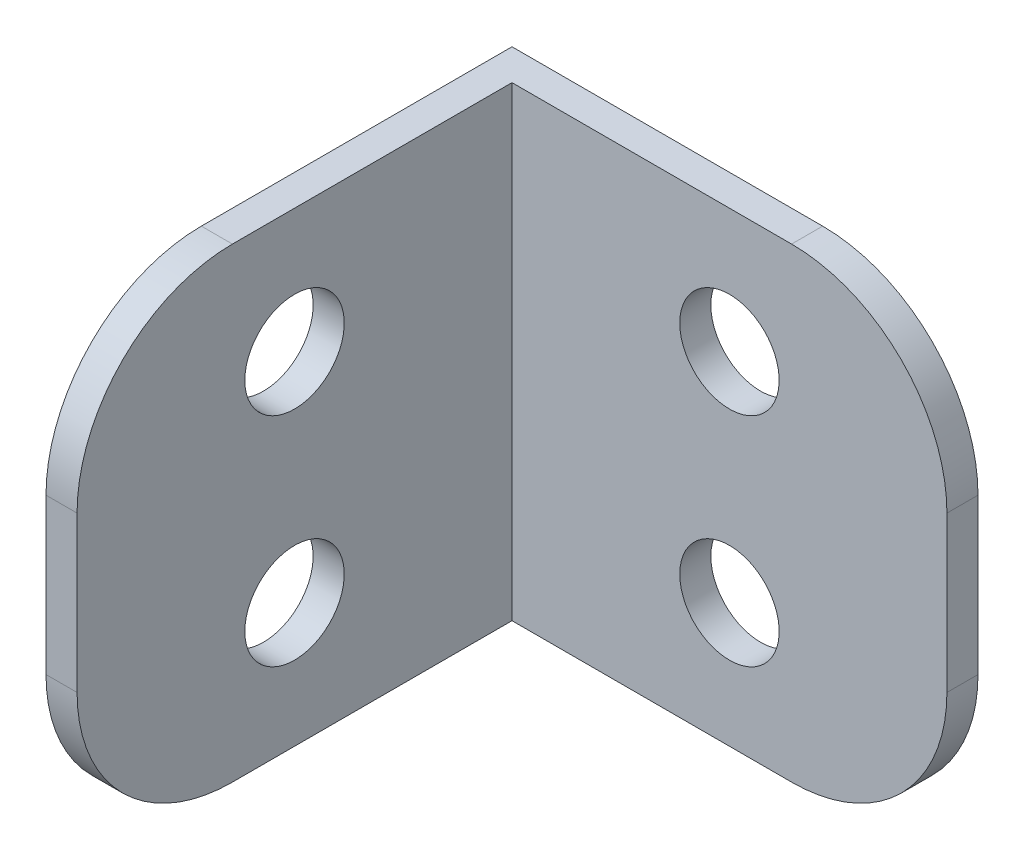
ISO-10303-21;
HEADER;
FILE_DESCRIPTION(('STEP AP214'),'2;1');
FILE_NAME('part.step','',(''),(''),'','','');
FILE_SCHEMA(('AUTOMOTIVE_DESIGN { 1 0 10303 214 1 1 1 1 }'));
ENDSEC;
DATA;
#1=APPLICATION_CONTEXT('core data for automotive mechanical design processes');
#2=APPLICATION_PROTOCOL_DEFINITION('international standard','automotive_design',2000,#1);
#3=PRODUCT_CONTEXT('',#1,'mechanical');
#4=PRODUCT('Part','Part','',(#3));
#5=PRODUCT_RELATED_PRODUCT_CATEGORY('part','',(#4));
#6=PRODUCT_DEFINITION_FORMATION('','',#4);
#7=PRODUCT_DEFINITION_CONTEXT('part definition',#1,'design');
#8=PRODUCT_DEFINITION('design','',#6,#7);
#9=PRODUCT_DEFINITION_SHAPE('','',#8);
#10=(LENGTH_UNIT() NAMED_UNIT(*) SI_UNIT(.MILLI.,.METRE.));
#11=(NAMED_UNIT(*) PLANE_ANGLE_UNIT() SI_UNIT($,.RADIAN.));
#12=(NAMED_UNIT(*) SI_UNIT($,.STERADIAN.) SOLID_ANGLE_UNIT());
#13=UNCERTAINTY_MEASURE_WITH_UNIT(LENGTH_MEASURE(1.E-05),#10,'distance_accuracy_value','');
#14=(GEOMETRIC_REPRESENTATION_CONTEXT(3) GLOBAL_UNCERTAINTY_ASSIGNED_CONTEXT((#13)) GLOBAL_UNIT_ASSIGNED_CONTEXT((#10,
#11,#12)) REPRESENTATION_CONTEXT('',''));
#15=CARTESIAN_POINT('',(0.,0.,0.));
#16=DIRECTION('',(0.,0.,1.));
#17=DIRECTION('',(1.,0.,0.));
#18=AXIS2_PLACEMENT_3D('',#15,#16,#17);
#19=CARTESIAN_POINT('',(0.,15.,1.));
#20=DIRECTION('',(-1.,0.,0.));
#21=DIRECTION('',(0.,0.,1.));
#22=AXIS2_PLACEMENT_3D('',#19,#20,#21);
#23=PLANE('',#22);
#24=DIRECTION('',(0.,-1.,0.));
#25=VECTOR('',#24,1.);
#26=CARTESIAN_POINT('',(0.,15.,1.));
#27=LINE('',#26,#25);
#28=CARTESIAN_POINT('',(0.,10.,1.));
#29=VERTEX_POINT('',#28);
#30=CARTESIAN_POINT('',(0.,5.,1.));
#31=VERTEX_POINT('',#30);
#32=EDGE_CURVE('E165',#29,#31,#27,.T.);
#33=ORIENTED_EDGE('',*,*,#32,.T.);
#34=DIRECTION('',(0.,0.,-1.));
#35=VECTOR('',#34,1.);
#36=CARTESIAN_POINT('',(0.,5.,1.));
#37=LINE('',#36,#35);
#38=CARTESIAN_POINT('',(0.,5.,0.));
#39=VERTEX_POINT('',#38);
#40=EDGE_CURVE('E223',#31,#39,#37,.T.);
#41=ORIENTED_EDGE('',*,*,#40,.T.);
#42=DIRECTION('',(0.,-1.,0.));
#43=VECTOR('',#42,1.);
#44=CARTESIAN_POINT('',(0.,15.,0.));
#45=LINE('',#44,#43);
#46=CARTESIAN_POINT('',(0.,10.,0.));
#47=VERTEX_POINT('',#46);
#48=EDGE_CURVE('E148',#47,#39,#45,.T.);
#49=ORIENTED_EDGE('',*,*,#48,.F.);
#50=DIRECTION('',(0.,0.,-1.));
#51=VECTOR('',#50,1.);
#52=CARTESIAN_POINT('',(0.,10.,1.));
#53=LINE('',#52,#51);
#54=EDGE_CURVE('E66',#47,#29,#53,.F.);
#55=ORIENTED_EDGE('',*,*,#54,.T.);
#56=EDGE_LOOP('',(#33,#41,#49,#55));
#57=FACE_BOUND('',#56,.T.);
#58=ADVANCED_FACE('F43',(#57),#23,.F.);
#59=CARTESIAN_POINT('',(0.,15.,0.));
#60=DIRECTION('',(0.,0.,1.));
#61=DIRECTION('',(1.,0.,0.));
#62=AXIS2_PLACEMENT_3D('',#59,#60,#61);
#63=PLANE('',#62);
#64=CARTESIAN_POINT('',(-7.,11.,0.));
#65=DIRECTION('',(0.,0.,-1.));
#66=DIRECTION('',(-1.,0.,0.));
#67=AXIS2_PLACEMENT_3D('',#64,#65,#66);
#68=CIRCLE('',#67,1.6);
#69=CARTESIAN_POINT('',(-8.6,11.,0.));
#70=VERTEX_POINT('',#69);
#71=EDGE_CURVE('E239',#70,#70,#68,.T.);
#72=ORIENTED_EDGE('',*,*,#71,.F.);
#73=EDGE_LOOP('',(#72));
#74=FACE_BOUND('',#73,.T.);
#75=CARTESIAN_POINT('',(-7.,4.,0.));
#76=DIRECTION('',(0.,0.,-1.));
#77=DIRECTION('',(-1.,0.,0.));
#78=AXIS2_PLACEMENT_3D('',#75,#76,#77);
#79=CIRCLE('',#78,1.6);
#80=CARTESIAN_POINT('',(-8.6,4.,0.));
#81=VERTEX_POINT('',#80);
#82=EDGE_CURVE('E251',#81,#81,#79,.T.);
#83=ORIENTED_EDGE('',*,*,#82,.F.);
#84=EDGE_LOOP('',(#83));
#85=FACE_BOUND('',#84,.T.);
#86=ORIENTED_EDGE('',*,*,#48,.T.);
#87=CARTESIAN_POINT('',(-5.,5.,0.));
#88=DIRECTION('',(0.,0.,1.));
#89=DIRECTION('',(1.,0.,0.));
#90=AXIS2_PLACEMENT_3D('',#87,#88,#89);
#91=CIRCLE('',#90,5.);
#92=CARTESIAN_POINT('',(-5.,0.,0.));
#93=VERTEX_POINT('',#92);
#94=EDGE_CURVE('E230',#39,#93,#91,.F.);
#95=ORIENTED_EDGE('',*,*,#94,.T.);
#96=DIRECTION('',(-1.,0.,0.));
#97=VECTOR('',#96,1.);
#98=CARTESIAN_POINT('',(0.,0.,0.));
#99=LINE('',#98,#97);
#100=CARTESIAN_POINT('',(-15.,0.,0.));
#101=VERTEX_POINT('',#100);
#102=EDGE_CURVE('E143',#93,#101,#99,.T.);
#103=ORIENTED_EDGE('',*,*,#102,.T.);
#104=DIRECTION('',(0.,-1.,0.));
#105=VECTOR('',#104,1.);
#106=CARTESIAN_POINT('',(-15.,15.,0.));
#107=LINE('',#106,#105);
#108=CARTESIAN_POINT('',(-15.,15.,0.));
#109=VERTEX_POINT('',#108);
#110=EDGE_CURVE('E139',#109,#101,#107,.T.);
#111=ORIENTED_EDGE('',*,*,#110,.F.);
#112=DIRECTION('',(-1.,0.,0.));
#113=VECTOR('',#112,1.);
#114=CARTESIAN_POINT('',(0.,15.,0.));
#115=LINE('',#114,#113);
#116=CARTESIAN_POINT('',(-5.,15.,0.));
#117=VERTEX_POINT('',#116);
#118=EDGE_CURVE('E124',#117,#109,#115,.T.);
#119=ORIENTED_EDGE('',*,*,#118,.F.);
#120=CARTESIAN_POINT('',(-5.,10.,0.));
#121=DIRECTION('',(0.,0.,1.));
#122=DIRECTION('',(1.,0.,0.));
#123=AXIS2_PLACEMENT_3D('',#120,#121,#122);
#124=CIRCLE('',#123,5.);
#125=EDGE_CURVE('E227',#117,#47,#124,.F.);
#126=ORIENTED_EDGE('',*,*,#125,.T.);
#127=EDGE_LOOP('',(#86,#95,#103,#111,#119,#126));
#128=FACE_BOUND('',#127,.T.);
#129=ADVANCED_FACE('F141',(#74,#85,#128),#63,.F.);
#130=CARTESIAN_POINT('',(-15.,15.,0.));
#131=DIRECTION('',(1.,0.,0.));
#132=DIRECTION('',(0.,0.,-1.));
#133=AXIS2_PLACEMENT_3D('',#130,#131,#132);
#134=PLANE('',#133);
#135=CARTESIAN_POINT('',(-15.,11.,8.));
#136=DIRECTION('',(-1.,0.,0.));
#137=DIRECTION('',(0.,0.,1.));
#138=AXIS2_PLACEMENT_3D('',#135,#136,#137);
#139=CIRCLE('',#138,1.6);
#140=CARTESIAN_POINT('',(-15.,11.,9.6));
#141=VERTEX_POINT('',#140);
#142=EDGE_CURVE('E245',#141,#141,#139,.T.);
#143=ORIENTED_EDGE('',*,*,#142,.F.);
#144=EDGE_LOOP('',(#143));
#145=FACE_BOUND('',#144,.T.);
#146=CARTESIAN_POINT('',(-15.,4.,8.));
#147=DIRECTION('',(-1.,0.,0.));
#148=DIRECTION('',(0.,0.,1.));
#149=AXIS2_PLACEMENT_3D('',#146,#147,#148);
#150=CIRCLE('',#149,1.6);
#151=CARTESIAN_POINT('',(-15.,4.,9.6));
#152=VERTEX_POINT('',#151);
#153=EDGE_CURVE('E253',#152,#152,#150,.T.);
#154=ORIENTED_EDGE('',*,*,#153,.F.);
#155=EDGE_LOOP('',(#154));
#156=FACE_BOUND('',#155,.T.);
#157=DIRECTION('',(0.,-1.,0.));
#158=VECTOR('',#157,1.);
#159=CARTESIAN_POINT('',(-15.,15.,15.));
#160=LINE('',#159,#158);
#161=CARTESIAN_POINT('',(-15.,10.,15.));
#162=VERTEX_POINT('',#161);
#163=CARTESIAN_POINT('',(-15.,5.,15.));
#164=VERTEX_POINT('',#163);
#165=EDGE_CURVE('E149',#162,#164,#160,.T.);
#166=ORIENTED_EDGE('',*,*,#165,.F.);
#167=CARTESIAN_POINT('',(-15.,10.,10.));
#168=DIRECTION('',(1.,0.,0.));
#169=DIRECTION('',(0.,0.,-1.));
#170=AXIS2_PLACEMENT_3D('',#167,#168,#169);
#171=CIRCLE('',#170,5.);
#172=CARTESIAN_POINT('',(-15.,15.,10.));
#173=VERTEX_POINT('',#172);
#174=EDGE_CURVE('E154',#162,#173,#171,.F.);
#175=ORIENTED_EDGE('',*,*,#174,.T.);
#176=DIRECTION('',(0.,0.,1.));
#177=VECTOR('',#176,1.);
#178=CARTESIAN_POINT('',(-15.,15.,0.));
#179=LINE('',#178,#177);
#180=EDGE_CURVE('E129',#109,#173,#179,.T.);
#181=ORIENTED_EDGE('',*,*,#180,.F.);
#182=ORIENTED_EDGE('',*,*,#110,.T.);
#183=DIRECTION('',(0.,0.,1.));
#184=VECTOR('',#183,1.);
#185=CARTESIAN_POINT('',(-15.,0.,0.));
#186=LINE('',#185,#184);
#187=CARTESIAN_POINT('',(-15.,0.,10.));
#188=VERTEX_POINT('',#187);
#189=EDGE_CURVE('E168',#101,#188,#186,.T.);
#190=ORIENTED_EDGE('',*,*,#189,.T.);
#191=CARTESIAN_POINT('',(-15.,5.,10.));
#192=DIRECTION('',(1.,0.,0.));
#193=DIRECTION('',(0.,0.,-1.));
#194=AXIS2_PLACEMENT_3D('',#191,#192,#193);
#195=CIRCLE('',#194,5.);
#196=EDGE_CURVE('E210',#188,#164,#195,.F.);
#197=ORIENTED_EDGE('',*,*,#196,.T.);
#198=EDGE_LOOP('',(#166,#175,#181,#182,#190,#197));
#199=FACE_BOUND('',#198,.T.);
#200=ADVANCED_FACE('F152',(#145,#156,#199),#134,.F.);
#201=CARTESIAN_POINT('',(-15.,15.,15.));
#202=DIRECTION('',(0.,0.,-1.));
#203=DIRECTION('',(-1.,0.,0.));
#204=AXIS2_PLACEMENT_3D('',#201,#202,#203);
#205=PLANE('',#204);
#206=DIRECTION('',(0.,-1.,0.));
#207=VECTOR('',#206,1.);
#208=CARTESIAN_POINT('',(-14.,15.,15.));
#209=LINE('',#208,#207);
#210=CARTESIAN_POINT('',(-14.,10.,15.));
#211=VERTEX_POINT('',#210);
#212=CARTESIAN_POINT('',(-14.,5.,15.));
#213=VERTEX_POINT('',#212);
#214=EDGE_CURVE('E183',#211,#213,#209,.T.);
#215=ORIENTED_EDGE('',*,*,#214,.F.);
#216=DIRECTION('',(1.,0.,0.));
#217=VECTOR('',#216,1.);
#218=CARTESIAN_POINT('',(-15.,10.,15.));
#219=LINE('',#218,#217);
#220=EDGE_CURVE('E207',#211,#162,#219,.F.);
#221=ORIENTED_EDGE('',*,*,#220,.T.);
#222=ORIENTED_EDGE('',*,*,#165,.T.);
#223=DIRECTION('',(1.,0.,0.));
#224=VECTOR('',#223,1.);
#225=CARTESIAN_POINT('',(-15.,5.,15.));
#226=LINE('',#225,#224);
#227=EDGE_CURVE('E203',#164,#213,#226,.T.);
#228=ORIENTED_EDGE('',*,*,#227,.T.);
#229=EDGE_LOOP('',(#215,#221,#222,#228));
#230=FACE_BOUND('',#229,.T.);
#231=ADVANCED_FACE('F277',(#230),#205,.F.);
#232=CARTESIAN_POINT('',(-14.,15.,15.));
#233=DIRECTION('',(-1.,0.,0.));
#234=DIRECTION('',(0.,0.,1.));
#235=AXIS2_PLACEMENT_3D('',#232,#233,#234);
#236=PLANE('',#235);
#237=CARTESIAN_POINT('',(-14.,11.,8.));
#238=DIRECTION('',(-1.,0.,0.));
#239=DIRECTION('',(0.,0.,1.));
#240=AXIS2_PLACEMENT_3D('',#237,#238,#239);
#241=CIRCLE('',#240,1.6);
#242=CARTESIAN_POINT('',(-14.,11.,9.6));
#243=VERTEX_POINT('',#242);
#244=EDGE_CURVE('E47',#243,#243,#241,.T.);
#245=ORIENTED_EDGE('',*,*,#244,.T.);
#246=EDGE_LOOP('',(#245));
#247=FACE_BOUND('',#246,.T.);
#248=CARTESIAN_POINT('',(-14.,4.,8.));
#249=DIRECTION('',(-1.,0.,0.));
#250=DIRECTION('',(0.,0.,1.));
#251=AXIS2_PLACEMENT_3D('',#248,#249,#250);
#252=CIRCLE('',#251,1.6);
#253=CARTESIAN_POINT('',(-14.,4.,9.6));
#254=VERTEX_POINT('',#253);
#255=EDGE_CURVE('E242',#254,#254,#252,.T.);
#256=ORIENTED_EDGE('',*,*,#255,.T.);
#257=EDGE_LOOP('',(#256));
#258=FACE_BOUND('',#257,.T.);
#259=DIRECTION('',(0.,0.,-1.));
#260=VECTOR('',#259,1.);
#261=CARTESIAN_POINT('',(-14.,15.,15.));
#262=LINE('',#261,#260);
#263=CARTESIAN_POINT('',(-14.,15.,10.));
#264=VERTEX_POINT('',#263);
#265=CARTESIAN_POINT('',(-14.,15.,1.));
#266=VERTEX_POINT('',#265);
#267=EDGE_CURVE('E156',#264,#266,#262,.T.);
#268=ORIENTED_EDGE('',*,*,#267,.F.);
#269=CARTESIAN_POINT('',(-14.,10.,10.));
#270=DIRECTION('',(-1.,0.,0.));
#271=DIRECTION('',(0.,0.,1.));
#272=AXIS2_PLACEMENT_3D('',#269,#270,#271);
#273=CIRCLE('',#272,5.);
#274=EDGE_CURVE('E200',#264,#211,#273,.F.);
#275=ORIENTED_EDGE('',*,*,#274,.T.);
#276=ORIENTED_EDGE('',*,*,#214,.T.);
#277=CARTESIAN_POINT('',(-14.,5.,10.));
#278=DIRECTION('',(-1.,0.,0.));
#279=DIRECTION('',(0.,0.,1.));
#280=AXIS2_PLACEMENT_3D('',#277,#278,#279);
#281=CIRCLE('',#280,5.);
#282=CARTESIAN_POINT('',(-14.,0.,10.));
#283=VERTEX_POINT('',#282);
#284=EDGE_CURVE('E197',#213,#283,#281,.F.);
#285=ORIENTED_EDGE('',*,*,#284,.T.);
#286=DIRECTION('',(0.,0.,-1.));
#287=VECTOR('',#286,1.);
#288=CARTESIAN_POINT('',(-14.,0.,15.));
#289=LINE('',#288,#287);
#290=CARTESIAN_POINT('',(-14.,0.,1.));
#291=VERTEX_POINT('',#290);
#292=EDGE_CURVE('E172',#283,#291,#289,.T.);
#293=ORIENTED_EDGE('',*,*,#292,.T.);
#294=DIRECTION('',(0.,-1.,0.));
#295=VECTOR('',#294,1.);
#296=CARTESIAN_POINT('',(-14.,15.,1.));
#297=LINE('',#296,#295);
#298=EDGE_CURVE('E179',#266,#291,#297,.T.);
#299=ORIENTED_EDGE('',*,*,#298,.F.);
#300=EDGE_LOOP('',(#268,#275,#276,#285,#293,#299));
#301=FACE_BOUND('',#300,.T.);
#302=ADVANCED_FACE('F307',(#247,#258,#301),#236,.F.);
#303=CARTESIAN_POINT('',(-14.,15.,1.));
#304=DIRECTION('',(0.,0.,-1.));
#305=DIRECTION('',(-1.,0.,0.));
#306=AXIS2_PLACEMENT_3D('',#303,#304,#305);
#307=PLANE('',#306);
#308=CARTESIAN_POINT('',(-7.,11.,1.));
#309=DIRECTION('',(0.,0.,-1.));
#310=DIRECTION('',(-1.,0.,0.));
#311=AXIS2_PLACEMENT_3D('',#308,#309,#310);
#312=CIRCLE('',#311,1.6);
#313=CARTESIAN_POINT('',(-8.6,11.,1.));
#314=VERTEX_POINT('',#313);
#315=EDGE_CURVE('E169',#314,#314,#312,.T.);
#316=ORIENTED_EDGE('',*,*,#315,.T.);
#317=EDGE_LOOP('',(#316));
#318=FACE_BOUND('',#317,.T.);
#319=CARTESIAN_POINT('',(-7.,4.,1.));
#320=DIRECTION('',(0.,0.,-1.));
#321=DIRECTION('',(-1.,0.,0.));
#322=AXIS2_PLACEMENT_3D('',#319,#320,#321);
#323=CIRCLE('',#322,1.6);
#324=CARTESIAN_POINT('',(-8.6,4.,1.));
#325=VERTEX_POINT('',#324);
#326=EDGE_CURVE('E235',#325,#325,#323,.T.);
#327=ORIENTED_EDGE('',*,*,#326,.T.);
#328=EDGE_LOOP('',(#327));
#329=FACE_BOUND('',#328,.T.);
#330=DIRECTION('',(1.,0.,0.));
#331=VECTOR('',#330,1.);
#332=CARTESIAN_POINT('',(-14.,0.,1.));
#333=LINE('',#332,#331);
#334=CARTESIAN_POINT('',(-5.,0.,1.));
#335=VERTEX_POINT('',#334);
#336=EDGE_CURVE('E136',#291,#335,#333,.T.);
#337=ORIENTED_EDGE('',*,*,#336,.T.);
#338=CARTESIAN_POINT('',(-5.,5.,1.));
#339=DIRECTION('',(0.,0.,-1.));
#340=DIRECTION('',(-1.,0.,0.));
#341=AXIS2_PLACEMENT_3D('',#338,#339,#340);
#342=CIRCLE('',#341,5.);
#343=EDGE_CURVE('E11',#335,#31,#342,.F.);
#344=ORIENTED_EDGE('',*,*,#343,.T.);
#345=ORIENTED_EDGE('',*,*,#32,.F.);
#346=CARTESIAN_POINT('',(-5.,10.,1.));
#347=DIRECTION('',(0.,0.,-1.));
#348=DIRECTION('',(-1.,0.,0.));
#349=AXIS2_PLACEMENT_3D('',#346,#347,#348);
#350=CIRCLE('',#349,5.);
#351=CARTESIAN_POINT('',(-5.,15.,1.));
#352=VERTEX_POINT('',#351);
#353=EDGE_CURVE('E53',#29,#352,#350,.F.);
#354=ORIENTED_EDGE('',*,*,#353,.T.);
#355=DIRECTION('',(1.,0.,0.));
#356=VECTOR('',#355,1.);
#357=CARTESIAN_POINT('',(-14.,15.,1.));
#358=LINE('',#357,#356);
#359=EDGE_CURVE('E159',#266,#352,#358,.T.);
#360=ORIENTED_EDGE('',*,*,#359,.F.);
#361=ORIENTED_EDGE('',*,*,#298,.T.);
#362=EDGE_LOOP('',(#337,#344,#345,#354,#360,#361));
#363=FACE_BOUND('',#362,.T.);
#364=ADVANCED_FACE('F303',(#318,#329,#363),#307,.F.);
#365=CARTESIAN_POINT('',(0.,15.,0.));
#366=DIRECTION('',(0.,1.,0.));
#367=DIRECTION('',(0.,0.,1.));
#368=AXIS2_PLACEMENT_3D('',#365,#366,#367);
#369=PLANE('',#368);
#370=ORIENTED_EDGE('',*,*,#180,.T.);
#371=DIRECTION('',(1.,0.,0.));
#372=VECTOR('',#371,1.);
#373=CARTESIAN_POINT('',(-14.,15.,10.));
#374=LINE('',#373,#372);
#375=EDGE_CURVE('E194',#173,#264,#374,.T.);
#376=ORIENTED_EDGE('',*,*,#375,.T.);
#377=ORIENTED_EDGE('',*,*,#267,.T.);
#378=ORIENTED_EDGE('',*,*,#359,.T.);
#379=DIRECTION('',(0.,0.,-1.));
#380=VECTOR('',#379,1.);
#381=CARTESIAN_POINT('',(-5.,15.,0.));
#382=LINE('',#381,#380);
#383=EDGE_CURVE('E133',#352,#117,#382,.T.);
#384=ORIENTED_EDGE('',*,*,#383,.T.);
#385=ORIENTED_EDGE('',*,*,#118,.T.);
#386=EDGE_LOOP('',(#370,#376,#377,#378,#384,#385));
#387=FACE_BOUND('',#386,.T.);
#388=ADVANCED_FACE('F126',(#387),#369,.T.);
#389=CARTESIAN_POINT('',(0.,0.,0.));
#390=DIRECTION('',(0.,1.,0.));
#391=DIRECTION('',(0.,0.,1.));
#392=AXIS2_PLACEMENT_3D('',#389,#390,#391);
#393=PLANE('',#392);
#394=ORIENTED_EDGE('',*,*,#292,.F.);
#395=DIRECTION('',(1.,0.,0.));
#396=VECTOR('',#395,1.);
#397=CARTESIAN_POINT('',(0.,0.,10.));
#398=LINE('',#397,#396);
#399=EDGE_CURVE('E218',#283,#188,#398,.F.);
#400=ORIENTED_EDGE('',*,*,#399,.T.);
#401=ORIENTED_EDGE('',*,*,#189,.F.);
#402=ORIENTED_EDGE('',*,*,#102,.F.);
#403=DIRECTION('',(0.,0.,-1.));
#404=VECTOR('',#403,1.);
#405=CARTESIAN_POINT('',(-5.,0.,0.));
#406=LINE('',#405,#404);
#407=EDGE_CURVE('E215',#93,#335,#406,.F.);
#408=ORIENTED_EDGE('',*,*,#407,.T.);
#409=ORIENTED_EDGE('',*,*,#336,.F.);
#410=EDGE_LOOP('',(#394,#400,#401,#402,#408,#409));
#411=FACE_BOUND('',#410,.T.);
#412=ADVANCED_FACE('F288',(#411),#393,.F.);
#413=CARTESIAN_POINT('',(0.,10.,10.));
#414=DIRECTION('',(-1.,0.,0.));
#415=DIRECTION('',(0.,0.,1.));
#416=AXIS2_PLACEMENT_3D('',#413,#414,#415);
#417=CYLINDRICAL_SURFACE('',#416,5.);
#418=ORIENTED_EDGE('',*,*,#174,.F.);
#419=ORIENTED_EDGE('',*,*,#220,.F.);
#420=ORIENTED_EDGE('',*,*,#274,.F.);
#421=ORIENTED_EDGE('',*,*,#375,.F.);
#422=EDGE_LOOP('',(#418,#419,#420,#421));
#423=FACE_BOUND('',#422,.T.);
#424=ADVANCED_FACE('F284',(#423),#417,.T.);
#425=CARTESIAN_POINT('',(-15.,5.,10.));
#426=DIRECTION('',(1.,0.,0.));
#427=DIRECTION('',(0.,0.,-1.));
#428=AXIS2_PLACEMENT_3D('',#425,#426,#427);
#429=CYLINDRICAL_SURFACE('',#428,5.);
#430=ORIENTED_EDGE('',*,*,#196,.F.);
#431=ORIENTED_EDGE('',*,*,#399,.F.);
#432=ORIENTED_EDGE('',*,*,#284,.F.);
#433=ORIENTED_EDGE('',*,*,#227,.F.);
#434=EDGE_LOOP('',(#430,#431,#432,#433));
#435=FACE_BOUND('',#434,.T.);
#436=ADVANCED_FACE('F287',(#435),#429,.T.);
#437=CARTESIAN_POINT('',(-5.,5.,1.));
#438=DIRECTION('',(0.,0.,-1.));
#439=DIRECTION('',(-1.,0.,0.));
#440=AXIS2_PLACEMENT_3D('',#437,#438,#439);
#441=CYLINDRICAL_SURFACE('',#440,5.);
#442=ORIENTED_EDGE('',*,*,#343,.F.);
#443=ORIENTED_EDGE('',*,*,#407,.F.);
#444=ORIENTED_EDGE('',*,*,#94,.F.);
#445=ORIENTED_EDGE('',*,*,#40,.F.);
#446=EDGE_LOOP('',(#442,#443,#444,#445));
#447=FACE_BOUND('',#446,.T.);
#448=ADVANCED_FACE('F291',(#447),#441,.T.);
#449=CARTESIAN_POINT('',(-5.,10.,0.));
#450=DIRECTION('',(0.,0.,1.));
#451=DIRECTION('',(1.,0.,0.));
#452=AXIS2_PLACEMENT_3D('',#449,#450,#451);
#453=CYLINDRICAL_SURFACE('',#452,5.);
#454=ORIENTED_EDGE('',*,*,#353,.F.);
#455=ORIENTED_EDGE('',*,*,#54,.F.);
#456=ORIENTED_EDGE('',*,*,#125,.F.);
#457=ORIENTED_EDGE('',*,*,#383,.F.);
#458=EDGE_LOOP('',(#454,#455,#456,#457));
#459=FACE_BOUND('',#458,.T.);
#460=ADVANCED_FACE('F45',(#459),#453,.T.);
#461=CARTESIAN_POINT('',(-7.,4.,15.));
#462=DIRECTION('',(0.,0.,-1.));
#463=DIRECTION('',(-1.,0.,0.));
#464=AXIS2_PLACEMENT_3D('',#461,#462,#463);
#465=CYLINDRICAL_SURFACE('',#464,1.6);
#466=ORIENTED_EDGE('',*,*,#82,.T.);
#467=EDGE_LOOP('',(#466));
#468=FACE_BOUND('',#467,.T.);
#469=ORIENTED_EDGE('',*,*,#326,.F.);
#470=EDGE_LOOP('',(#469));
#471=FACE_BOUND('',#470,.T.);
#472=ADVANCED_FACE('F267',(#468,#471),#465,.F.);
#473=CARTESIAN_POINT('',(-7.,11.,15.));
#474=DIRECTION('',(0.,0.,-1.));
#475=DIRECTION('',(-1.,0.,0.));
#476=AXIS2_PLACEMENT_3D('',#473,#474,#475);
#477=CYLINDRICAL_SURFACE('',#476,1.6);
#478=ORIENTED_EDGE('',*,*,#71,.T.);
#479=EDGE_LOOP('',(#478));
#480=FACE_BOUND('',#479,.T.);
#481=ORIENTED_EDGE('',*,*,#315,.F.);
#482=EDGE_LOOP('',(#481));
#483=FACE_BOUND('',#482,.T.);
#484=ADVANCED_FACE('F333',(#480,#483),#477,.F.);
#485=CARTESIAN_POINT('',(0.,4.,8.));
#486=DIRECTION('',(-1.,0.,0.));
#487=DIRECTION('',(0.,0.,1.));
#488=AXIS2_PLACEMENT_3D('',#485,#486,#487);
#489=CYLINDRICAL_SURFACE('',#488,1.6);
#490=ORIENTED_EDGE('',*,*,#153,.T.);
#491=EDGE_LOOP('',(#490));
#492=FACE_BOUND('',#491,.T.);
#493=ORIENTED_EDGE('',*,*,#255,.F.);
#494=EDGE_LOOP('',(#493));
#495=FACE_BOUND('',#494,.T.);
#496=ADVANCED_FACE('F336',(#492,#495),#489,.F.);
#497=CARTESIAN_POINT('',(0.,11.,8.));
#498=DIRECTION('',(-1.,0.,0.));
#499=DIRECTION('',(0.,0.,1.));
#500=AXIS2_PLACEMENT_3D('',#497,#498,#499);
#501=CYLINDRICAL_SURFACE('',#500,1.6);
#502=ORIENTED_EDGE('',*,*,#142,.T.);
#503=EDGE_LOOP('',(#502));
#504=FACE_BOUND('',#503,.T.);
#505=ORIENTED_EDGE('',*,*,#244,.F.);
#506=EDGE_LOOP('',(#505));
#507=FACE_BOUND('',#506,.T.);
#508=ADVANCED_FACE('F340',(#504,#507),#501,.F.);
#509=CLOSED_SHELL('',(#58,#129,#200,#231,#302,#364,#388,#412,#424,#436,#448,#460,#472,#484,#496,#508));
#510=MANIFOLD_SOLID_BREP('B2',#509);
#511=ADVANCED_BREP_SHAPE_REPRESENTATION('',(#18,#510),#14);
#512=SHAPE_DEFINITION_REPRESENTATION(#9,#511);
ENDSEC;
END-ISO-10303-21;
